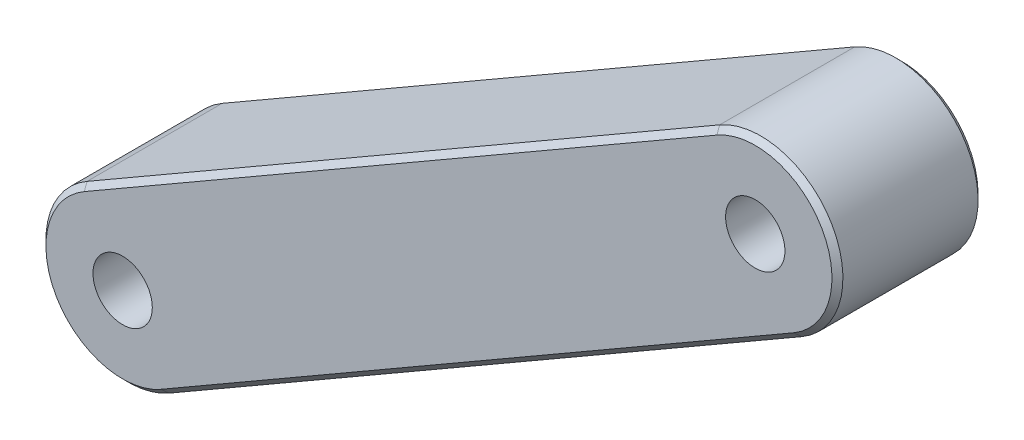
ISO-10303-21;
HEADER;
FILE_DESCRIPTION(('STEP AP214'),'2;1');
FILE_NAME('part.step','',(''),(''),'','','');
FILE_SCHEMA(('AUTOMOTIVE_DESIGN { 1 0 10303 214 1 1 1 1 }'));
ENDSEC;
DATA;
#1=APPLICATION_CONTEXT('core data for automotive mechanical design processes');
#2=APPLICATION_PROTOCOL_DEFINITION('international standard','automotive_design',2000,#1);
#3=PRODUCT_CONTEXT('',#1,'mechanical');
#4=PRODUCT('Part','Part','',(#3));
#5=PRODUCT_RELATED_PRODUCT_CATEGORY('part','',(#4));
#6=PRODUCT_DEFINITION_FORMATION('','',#4);
#7=PRODUCT_DEFINITION_CONTEXT('part definition',#1,'design');
#8=PRODUCT_DEFINITION('design','',#6,#7);
#9=PRODUCT_DEFINITION_SHAPE('','',#8);
#10=(LENGTH_UNIT() NAMED_UNIT(*) SI_UNIT(.MILLI.,.METRE.));
#11=(NAMED_UNIT(*) PLANE_ANGLE_UNIT() SI_UNIT($,.RADIAN.));
#12=(NAMED_UNIT(*) SI_UNIT($,.STERADIAN.) SOLID_ANGLE_UNIT());
#13=UNCERTAINTY_MEASURE_WITH_UNIT(LENGTH_MEASURE(1.E-05),#10,'distance_accuracy_value','');
#14=(GEOMETRIC_REPRESENTATION_CONTEXT(3) GLOBAL_UNCERTAINTY_ASSIGNED_CONTEXT((#13)) GLOBAL_UNIT_ASSIGNED_CONTEXT((#10,
#11,#12)) REPRESENTATION_CONTEXT('',''));
#15=CARTESIAN_POINT('',(0.,0.,0.));
#16=DIRECTION('',(0.,0.,1.));
#17=DIRECTION('',(1.,0.,0.));
#18=AXIS2_PLACEMENT_3D('',#15,#16,#17);
#19=CARTESIAN_POINT('',(19.5705080756888,-37.8971143170299,-3.7));
#20=DIRECTION('',(-0.353553390593272,0.612372435695791,0.707106781186551));
#21=DIRECTION('',(0.866025403784439,0.5,0.));
#22=AXIS2_PLACEMENT_3D('',#19,#20,#21);
#23=PLANE('',#22);
#24=DIRECTION('',(-0.353553390593276,0.612372435695794,-0.707106781186547));
#25=VECTOR('',#24,1.);
#26=CARTESIAN_POINT('',(2.25,-47.89711431703,-3.7));
#27=LINE('',#26,#25);
#28=CARTESIAN_POINT('',(2.25,-47.89711431703,-3.7));
#29=VERTEX_POINT('',#28);
#30=CARTESIAN_POINT('',(2.1,-47.6373066958946,-4.));
#31=VERTEX_POINT('',#30);
#32=EDGE_CURVE('E25',#29,#31,#27,.T.);
#33=ORIENTED_EDGE('',*,*,#32,.T.);
#34=DIRECTION('',(-0.866025403784439,-0.5,0.));
#35=VECTOR('',#34,1.);
#36=CARTESIAN_POINT('',(19.4205080756887,-37.6373066958947,-4.));
#37=LINE('',#36,#35);
#38=CARTESIAN_POINT('',(36.7410161513776,-27.6373066958946,-4.));
#39=VERTEX_POINT('',#38);
#40=EDGE_CURVE('E168',#39,#31,#37,.T.);
#41=ORIENTED_EDGE('',*,*,#40,.F.);
#42=DIRECTION('',(0.353553390593281,-0.612372435695797,0.707106781186542));
#43=VECTOR('',#42,1.);
#44=CARTESIAN_POINT('',(36.7410161513776,-27.6373066958946,-4.));
#45=LINE('',#44,#43);
#46=CARTESIAN_POINT('',(36.8910161513776,-27.89711431703,-3.7));
#47=VERTEX_POINT('',#46);
#48=EDGE_CURVE('E11',#39,#47,#45,.T.);
#49=ORIENTED_EDGE('',*,*,#48,.T.);
#50=DIRECTION('',(0.866025403784439,0.5,0.));
#51=VECTOR('',#50,1.);
#52=CARTESIAN_POINT('',(19.5705080756888,-37.8971143170299,-3.7));
#53=LINE('',#52,#51);
#54=EDGE_CURVE('E188',#29,#47,#53,.T.);
#55=ORIENTED_EDGE('',*,*,#54,.F.);
#56=EDGE_LOOP('',(#33,#41,#49,#55));
#57=FACE_BOUND('',#56,.T.);
#58=ADVANCED_FACE('F17',(#57),#23,.F.);
#59=CARTESIAN_POINT('',(34.6410161513775,-24.,-4.));
#60=DIRECTION('',(0.,0.,1.));
#61=DIRECTION('',(1.,0.,0.));
#62=AXIS2_PLACEMENT_3D('',#59,#60,#61);
#63=CONICAL_SURFACE('',#62,4.2,0.78539816339745);
#64=DIRECTION('',(-0.353553390593268,0.612372435695803,0.707106781186543));
#65=VECTOR('',#64,1.);
#66=CARTESIAN_POINT('',(32.5410161513775,-20.3626933041054,-4.));
#67=LINE('',#66,#65);
#68=CARTESIAN_POINT('',(32.5410161513775,-20.3626933041054,-4.));
#69=VERTEX_POINT('',#68);
#70=CARTESIAN_POINT('',(32.3910161513776,-20.10288568297,-3.7));
#71=VERTEX_POINT('',#70);
#72=EDGE_CURVE('E234',#69,#71,#67,.T.);
#73=ORIENTED_EDGE('',*,*,#72,.T.);
#74=CARTESIAN_POINT('',(34.6410161513775,-24.,-3.7));
#75=DIRECTION('',(0.,0.,1.));
#76=DIRECTION('',(1.,0.,0.));
#77=AXIS2_PLACEMENT_3D('',#74,#75,#76);
#78=CIRCLE('',#77,4.5);
#79=EDGE_CURVE('E189',#47,#71,#78,.T.);
#80=ORIENTED_EDGE('',*,*,#79,.F.);
#81=ORIENTED_EDGE('',*,*,#48,.F.);
#82=CARTESIAN_POINT('',(34.6410161513775,-24.,-4.));
#83=DIRECTION('',(0.,0.,-1.));
#84=DIRECTION('',(1.,0.,0.));
#85=AXIS2_PLACEMENT_3D('',#82,#83,#84);
#86=CIRCLE('',#85,4.2);
#87=EDGE_CURVE('E164',#69,#39,#86,.T.);
#88=ORIENTED_EDGE('',*,*,#87,.F.);
#89=EDGE_LOOP('',(#73,#80,#81,#88));
#90=FACE_BOUND('',#89,.T.);
#91=ADVANCED_FACE('F253',(#90),#63,.T.);
#92=CARTESIAN_POINT('',(0.,-44.,-4.));
#93=DIRECTION('',(0.,0.,1.));
#94=DIRECTION('',(1.,0.,0.));
#95=AXIS2_PLACEMENT_3D('',#92,#93,#94);
#96=CONICAL_SURFACE('',#95,4.2,0.78539816339745);
#97=DIRECTION('',(0.353553390593275,-0.612372435695797,-0.707106781186545));
#98=VECTOR('',#97,1.);
#99=CARTESIAN_POINT('',(-2.25,-40.10288568297,-3.7));
#100=LINE('',#99,#98);
#101=CARTESIAN_POINT('',(-2.25,-40.10288568297,-3.7));
#102=VERTEX_POINT('',#101);
#103=CARTESIAN_POINT('',(-2.1,-40.3626933041054,-4.));
#104=VERTEX_POINT('',#103);
#105=EDGE_CURVE('E237',#102,#104,#100,.T.);
#106=ORIENTED_EDGE('',*,*,#105,.T.);
#107=CARTESIAN_POINT('',(0.,-44.,-4.));
#108=DIRECTION('',(0.,0.,-1.));
#109=DIRECTION('',(1.,0.,0.));
#110=AXIS2_PLACEMENT_3D('',#107,#108,#109);
#111=CIRCLE('',#110,4.2);
#112=EDGE_CURVE('E176',#31,#104,#111,.T.);
#113=ORIENTED_EDGE('',*,*,#112,.F.);
#114=ORIENTED_EDGE('',*,*,#32,.F.);
#115=CARTESIAN_POINT('',(0.,-44.,-3.7));
#116=DIRECTION('',(0.,0.,1.));
#117=DIRECTION('',(1.,0.,0.));
#118=AXIS2_PLACEMENT_3D('',#115,#116,#117);
#119=CIRCLE('',#118,4.5);
#120=EDGE_CURVE('E141',#102,#29,#119,.T.);
#121=ORIENTED_EDGE('',*,*,#120,.F.);
#122=EDGE_LOOP('',(#106,#113,#114,#121));
#123=FACE_BOUND('',#122,.T.);
#124=ADVANCED_FACE('F247',(#123),#96,.T.);
#125=CARTESIAN_POINT('',(15.2205080756887,-30.3626933041054,-4.));
#126=DIRECTION('',(-0.353553390593274,0.612372435695794,-0.707106781186548));
#127=DIRECTION('',(-0.894427190999916,0.,0.447213595499958));
#128=AXIS2_PLACEMENT_3D('',#125,#126,#127);
#129=PLANE('',#128);
#130=ORIENTED_EDGE('',*,*,#72,.F.);
#131=DIRECTION('',(0.866025403784439,0.5,0.));
#132=VECTOR('',#131,1.);
#133=CARTESIAN_POINT('',(32.5410161513775,-20.3626933041054,-4.));
#134=LINE('',#133,#132);
#135=EDGE_CURVE('E197',#104,#69,#134,.T.);
#136=ORIENTED_EDGE('',*,*,#135,.F.);
#137=ORIENTED_EDGE('',*,*,#105,.F.);
#138=DIRECTION('',(-0.866025403784439,-0.5,0.));
#139=VECTOR('',#138,1.);
#140=CARTESIAN_POINT('',(-2.25,-40.10288568297,-3.7));
#141=LINE('',#140,#139);
#142=EDGE_CURVE('E155',#71,#102,#141,.T.);
#143=ORIENTED_EDGE('',*,*,#142,.F.);
#144=EDGE_LOOP('',(#130,#136,#137,#143));
#145=FACE_BOUND('',#144,.T.);
#146=ADVANCED_FACE('F428',(#145),#129,.T.);
#147=CARTESIAN_POINT('',(19.4205080756888,-37.6373066958947,4.));
#148=DIRECTION('',(0.353553390593272,-0.612372435695791,0.707106781186551));
#149=DIRECTION('',(-0.866025403784439,-0.5,0.));
#150=AXIS2_PLACEMENT_3D('',#147,#148,#149);
#151=PLANE('',#150);
#152=DIRECTION('',(0.353553390593278,-0.612372435695794,-0.707106781186547));
#153=VECTOR('',#152,1.);
#154=CARTESIAN_POINT('',(2.1,-47.6373066958946,4.));
#155=LINE('',#154,#153);
#156=CARTESIAN_POINT('',(2.1,-47.6373066958946,4.));
#157=VERTEX_POINT('',#156);
#158=CARTESIAN_POINT('',(2.25,-47.89711431703,3.7));
#159=VERTEX_POINT('',#158);
#160=EDGE_CURVE('E129',#157,#159,#155,.T.);
#161=ORIENTED_EDGE('',*,*,#160,.T.);
#162=DIRECTION('',(-0.866025403784439,-0.5,0.));
#163=VECTOR('',#162,1.);
#164=CARTESIAN_POINT('',(2.25,-47.89711431703,3.7));
#165=LINE('',#164,#163);
#166=CARTESIAN_POINT('',(36.8910161513776,-27.89711431703,3.7));
#167=VERTEX_POINT('',#166);
#168=EDGE_CURVE('E184',#167,#159,#165,.T.);
#169=ORIENTED_EDGE('',*,*,#168,.F.);
#170=DIRECTION('',(-0.353553390593267,0.612372435695801,0.707106781186546));
#171=VECTOR('',#170,1.);
#172=CARTESIAN_POINT('',(36.8910161513776,-27.89711431703,3.7));
#173=LINE('',#172,#171);
#174=CARTESIAN_POINT('',(36.7410161513776,-27.6373066958946,4.));
#175=VERTEX_POINT('',#174);
#176=EDGE_CURVE('E231',#167,#175,#173,.T.);
#177=ORIENTED_EDGE('',*,*,#176,.T.);
#178=DIRECTION('',(0.866025403784439,0.5,0.));
#179=VECTOR('',#178,1.);
#180=CARTESIAN_POINT('',(36.7410161513776,-27.6373066958946,4.));
#181=LINE('',#180,#179);
#182=EDGE_CURVE('E204',#157,#175,#181,.T.);
#183=ORIENTED_EDGE('',*,*,#182,.F.);
#184=EDGE_LOOP('',(#161,#169,#177,#183));
#185=FACE_BOUND('',#184,.T.);
#186=ADVANCED_FACE('F264',(#185),#151,.T.);
#187=CARTESIAN_POINT('',(34.6410161513775,-24.,3.7));
#188=DIRECTION('',(0.,0.,-1.));
#189=DIRECTION('',(-1.,0.,0.));
#190=AXIS2_PLACEMENT_3D('',#187,#188,#189);
#191=CONICAL_SURFACE('',#190,4.5,0.785398163397446);
#192=DIRECTION('',(0.353553390593267,-0.612372435695794,0.707106781186552));
#193=VECTOR('',#192,1.);
#194=CARTESIAN_POINT('',(32.3910161513776,-20.10288568297,3.7));
#195=LINE('',#194,#193);
#196=CARTESIAN_POINT('',(32.3910161513776,-20.10288568297,3.7));
#197=VERTEX_POINT('',#196);
#198=CARTESIAN_POINT('',(32.5410161513775,-20.3626933041054,4.));
#199=VERTEX_POINT('',#198);
#200=EDGE_CURVE('E130',#197,#199,#195,.T.);
#201=ORIENTED_EDGE('',*,*,#200,.T.);
#202=CARTESIAN_POINT('',(34.6410161513775,-24.,4.));
#203=DIRECTION('',(0.,0.,1.));
#204=DIRECTION('',(1.,0.,0.));
#205=AXIS2_PLACEMENT_3D('',#202,#203,#204);
#206=CIRCLE('',#205,4.2);
#207=EDGE_CURVE('E208',#175,#199,#206,.T.);
#208=ORIENTED_EDGE('',*,*,#207,.F.);
#209=ORIENTED_EDGE('',*,*,#176,.F.);
#210=CARTESIAN_POINT('',(34.6410161513775,-24.,3.7));
#211=DIRECTION('',(0.,0.,-1.));
#212=DIRECTION('',(1.,0.,0.));
#213=AXIS2_PLACEMENT_3D('',#210,#211,#212);
#214=CIRCLE('',#213,4.5);
#215=EDGE_CURVE('E193',#197,#167,#214,.T.);
#216=ORIENTED_EDGE('',*,*,#215,.F.);
#217=EDGE_LOOP('',(#201,#208,#209,#216));
#218=FACE_BOUND('',#217,.T.);
#219=ADVANCED_FACE('F427',(#218),#191,.T.);
#220=CARTESIAN_POINT('',(0.,-44.,3.7));
#221=DIRECTION('',(0.,0.,-1.));
#222=DIRECTION('',(-1.,0.,0.));
#223=AXIS2_PLACEMENT_3D('',#220,#221,#222);
#224=CONICAL_SURFACE('',#223,4.5,0.78539816339745);
#225=DIRECTION('',(-0.353553390593273,0.612372435695792,-0.70710678118655));
#226=VECTOR('',#225,1.);
#227=CARTESIAN_POINT('',(-2.1,-40.3626933041054,4.));
#228=LINE('',#227,#226);
#229=CARTESIAN_POINT('',(-2.1,-40.3626933041054,4.));
#230=VERTEX_POINT('',#229);
#231=CARTESIAN_POINT('',(-2.25,-40.10288568297,3.7));
#232=VERTEX_POINT('',#231);
#233=EDGE_CURVE('E117',#230,#232,#228,.T.);
#234=ORIENTED_EDGE('',*,*,#233,.T.);
#235=CARTESIAN_POINT('',(0.,-44.,3.7));
#236=DIRECTION('',(0.,0.,-1.));
#237=DIRECTION('',(1.,0.,0.));
#238=AXIS2_PLACEMENT_3D('',#235,#236,#237);
#239=CIRCLE('',#238,4.5);
#240=EDGE_CURVE('E120',#159,#232,#239,.T.);
#241=ORIENTED_EDGE('',*,*,#240,.F.);
#242=ORIENTED_EDGE('',*,*,#160,.F.);
#243=CARTESIAN_POINT('',(0.,-44.,4.));
#244=DIRECTION('',(0.,0.,1.));
#245=DIRECTION('',(1.,0.,0.));
#246=AXIS2_PLACEMENT_3D('',#243,#244,#245);
#247=CIRCLE('',#246,4.2);
#248=EDGE_CURVE('E123',#230,#157,#247,.T.);
#249=ORIENTED_EDGE('',*,*,#248,.F.);
#250=EDGE_LOOP('',(#234,#241,#242,#249));
#251=FACE_BOUND('',#250,.T.);
#252=ADVANCED_FACE('F119',(#251),#224,.T.);
#253=CARTESIAN_POINT('',(15.0705080756888,-30.10288568297,3.7));
#254=DIRECTION('',(0.353553390593274,-0.612372435695794,-0.707106781186548));
#255=DIRECTION('',(0.,-0.755928946018455,0.654653670707977));
#256=AXIS2_PLACEMENT_3D('',#253,#254,#255);
#257=PLANE('',#256);
#258=ORIENTED_EDGE('',*,*,#200,.F.);
#259=DIRECTION('',(0.866025403784439,0.5,0.));
#260=VECTOR('',#259,1.);
#261=CARTESIAN_POINT('',(15.0705080756888,-30.10288568297,3.7));
#262=LINE('',#261,#260);
#263=EDGE_CURVE('E144',#232,#197,#262,.T.);
#264=ORIENTED_EDGE('',*,*,#263,.F.);
#265=ORIENTED_EDGE('',*,*,#233,.F.);
#266=DIRECTION('',(-0.866025403784439,-0.5,0.));
#267=VECTOR('',#266,1.);
#268=CARTESIAN_POINT('',(15.2205080756887,-30.3626933041054,4.));
#269=LINE('',#268,#267);
#270=EDGE_CURVE('E214',#199,#230,#269,.T.);
#271=ORIENTED_EDGE('',*,*,#270,.F.);
#272=EDGE_LOOP('',(#258,#264,#265,#271));
#273=FACE_BOUND('',#272,.T.);
#274=ADVANCED_FACE('F145',(#273),#257,.F.);
#275=CARTESIAN_POINT('',(0.,-44.,-78.7236498692896));
#276=DIRECTION('',(0.,0.,1.));
#277=DIRECTION('',(1.,0.,0.));
#278=AXIS2_PLACEMENT_3D('',#275,#276,#277);
#279=CYLINDRICAL_SURFACE('',#278,1.625);
#280=CARTESIAN_POINT('',(0.,-44.,-4.));
#281=DIRECTION('',(0.,0.,1.));
#282=DIRECTION('',(1.,0.,0.));
#283=AXIS2_PLACEMENT_3D('',#280,#281,#282);
#284=CIRCLE('',#283,1.625);
#285=CARTESIAN_POINT('',(1.625,-44.,-4.));
#286=VERTEX_POINT('',#285);
#287=EDGE_CURVE('E42',#286,#286,#284,.T.);
#288=ORIENTED_EDGE('',*,*,#287,.F.);
#289=EDGE_LOOP('',(#288));
#290=FACE_BOUND('',#289,.T.);
#291=CARTESIAN_POINT('',(0.,-44.,4.));
#292=DIRECTION('',(0.,0.,1.));
#293=DIRECTION('',(1.,0.,0.));
#294=AXIS2_PLACEMENT_3D('',#291,#292,#293);
#295=CIRCLE('',#294,1.625);
#296=CARTESIAN_POINT('',(1.625,-44.,4.));
#297=VERTEX_POINT('',#296);
#298=EDGE_CURVE('E217',#297,#297,#295,.T.);
#299=ORIENTED_EDGE('',*,*,#298,.T.);
#300=EDGE_LOOP('',(#299));
#301=FACE_BOUND('',#300,.T.);
#302=ADVANCED_FACE('F436',(#290,#301),#279,.F.);
#303=CARTESIAN_POINT('',(34.6410161513775,-24.,-78.7236498692896));
#304=DIRECTION('',(0.,0.,1.));
#305=DIRECTION('',(1.,0.,0.));
#306=AXIS2_PLACEMENT_3D('',#303,#304,#305);
#307=CYLINDRICAL_SURFACE('',#306,1.625);
#308=CARTESIAN_POINT('',(34.6410161513775,-24.,-4.));
#309=DIRECTION('',(0.,0.,1.));
#310=DIRECTION('',(1.,0.,0.));
#311=AXIS2_PLACEMENT_3D('',#308,#309,#310);
#312=CIRCLE('',#311,1.625);
#313=CARTESIAN_POINT('',(36.2660161513775,-24.,-4.));
#314=VERTEX_POINT('',#313);
#315=EDGE_CURVE('E35',#314,#314,#312,.T.);
#316=ORIENTED_EDGE('',*,*,#315,.F.);
#317=EDGE_LOOP('',(#316));
#318=FACE_BOUND('',#317,.T.);
#319=CARTESIAN_POINT('',(34.6410161513775,-24.,4.));
#320=DIRECTION('',(0.,0.,1.));
#321=DIRECTION('',(1.,0.,0.));
#322=AXIS2_PLACEMENT_3D('',#319,#320,#321);
#323=CIRCLE('',#322,1.625);
#324=CARTESIAN_POINT('',(36.2660161513775,-24.,4.));
#325=VERTEX_POINT('',#324);
#326=EDGE_CURVE('E169',#325,#325,#323,.T.);
#327=ORIENTED_EDGE('',*,*,#326,.T.);
#328=EDGE_LOOP('',(#327));
#329=FACE_BOUND('',#328,.T.);
#330=ADVANCED_FACE('F441',(#318,#329),#307,.F.);
#331=CARTESIAN_POINT('',(17.3205080756888,-34.,-4.));
#332=DIRECTION('',(0.,0.,1.));
#333=DIRECTION('',(1.,0.,0.));
#334=AXIS2_PLACEMENT_3D('',#331,#332,#333);
#335=PLANE('',#334);
#336=ORIENTED_EDGE('',*,*,#315,.T.);
#337=EDGE_LOOP('',(#336));
#338=FACE_BOUND('',#337,.T.);
#339=ORIENTED_EDGE('',*,*,#287,.T.);
#340=EDGE_LOOP('',(#339));
#341=FACE_BOUND('',#340,.T.);
#342=ORIENTED_EDGE('',*,*,#87,.T.);
#343=ORIENTED_EDGE('',*,*,#40,.T.);
#344=ORIENTED_EDGE('',*,*,#112,.T.);
#345=ORIENTED_EDGE('',*,*,#135,.T.);
#346=EDGE_LOOP('',(#342,#343,#344,#345));
#347=FACE_BOUND('',#346,.T.);
#348=ADVANCED_FACE('F250',(#338,#341,#347),#335,.F.);
#349=CARTESIAN_POINT('',(17.3205080756888,-34.,4.));
#350=DIRECTION('',(0.,0.,1.));
#351=DIRECTION('',(1.,0.,0.));
#352=AXIS2_PLACEMENT_3D('',#349,#350,#351);
#353=PLANE('',#352);
#354=ORIENTED_EDGE('',*,*,#326,.F.);
#355=EDGE_LOOP('',(#354));
#356=FACE_BOUND('',#355,.T.);
#357=ORIENTED_EDGE('',*,*,#298,.F.);
#358=EDGE_LOOP('',(#357));
#359=FACE_BOUND('',#358,.T.);
#360=ORIENTED_EDGE('',*,*,#248,.T.);
#361=ORIENTED_EDGE('',*,*,#182,.T.);
#362=ORIENTED_EDGE('',*,*,#207,.T.);
#363=ORIENTED_EDGE('',*,*,#270,.T.);
#364=EDGE_LOOP('',(#360,#361,#362,#363));
#365=FACE_BOUND('',#364,.T.);
#366=ADVANCED_FACE('F462',(#356,#359,#365),#353,.T.);
#367=CARTESIAN_POINT('',(34.6410161513775,-24.,4.));
#368=DIRECTION('',(0.,0.,-1.));
#369=DIRECTION('',(-1.,0.,0.));
#370=AXIS2_PLACEMENT_3D('',#367,#368,#369);
#371=CYLINDRICAL_SURFACE('',#370,4.5);
#372=DIRECTION('',(0.,0.,-1.));
#373=VECTOR('',#372,1.);
#374=CARTESIAN_POINT('',(32.3910161513776,-20.10288568297,4.));
#375=LINE('',#374,#373);
#376=EDGE_CURVE('E150',#197,#71,#375,.T.);
#377=ORIENTED_EDGE('',*,*,#376,.F.);
#378=ORIENTED_EDGE('',*,*,#215,.T.);
#379=DIRECTION('',(0.,0.,-1.));
#380=VECTOR('',#379,1.);
#381=CARTESIAN_POINT('',(36.8910161513776,-27.89711431703,4.));
#382=LINE('',#381,#380);
#383=EDGE_CURVE('E180',#167,#47,#382,.T.);
#384=ORIENTED_EDGE('',*,*,#383,.T.);
#385=ORIENTED_EDGE('',*,*,#79,.T.);
#386=EDGE_LOOP('',(#377,#378,#384,#385));
#387=FACE_BOUND('',#386,.T.);
#388=ADVANCED_FACE('F260',(#387),#371,.T.);
#389=CARTESIAN_POINT('',(19.5705080756888,-37.8971143170299,4.));
#390=DIRECTION('',(-0.5,0.866025403784439,0.));
#391=DIRECTION('',(0.,0.,1.));
#392=AXIS2_PLACEMENT_3D('',#389,#390,#391);
#393=PLANE('',#392);
#394=ORIENTED_EDGE('',*,*,#383,.F.);
#395=ORIENTED_EDGE('',*,*,#168,.T.);
#396=DIRECTION('',(0.,0.,-1.));
#397=VECTOR('',#396,1.);
#398=CARTESIAN_POINT('',(2.25,-47.89711431703,4.));
#399=LINE('',#398,#397);
#400=EDGE_CURVE('E139',#159,#29,#399,.T.);
#401=ORIENTED_EDGE('',*,*,#400,.T.);
#402=ORIENTED_EDGE('',*,*,#54,.T.);
#403=EDGE_LOOP('',(#394,#395,#401,#402));
#404=FACE_BOUND('',#403,.T.);
#405=ADVANCED_FACE('F259',(#404),#393,.F.);
#406=CARTESIAN_POINT('',(0.,-44.,4.));
#407=DIRECTION('',(0.,0.,-1.));
#408=DIRECTION('',(-1.,0.,0.));
#409=AXIS2_PLACEMENT_3D('',#406,#407,#408);
#410=CYLINDRICAL_SURFACE('',#409,4.5);
#411=ORIENTED_EDGE('',*,*,#400,.F.);
#412=ORIENTED_EDGE('',*,*,#240,.T.);
#413=DIRECTION('',(0.,0.,-1.));
#414=VECTOR('',#413,1.);
#415=CARTESIAN_POINT('',(-2.25,-40.10288568297,4.));
#416=LINE('',#415,#414);
#417=EDGE_CURVE('E137',#232,#102,#416,.T.);
#418=ORIENTED_EDGE('',*,*,#417,.T.);
#419=ORIENTED_EDGE('',*,*,#120,.T.);
#420=EDGE_LOOP('',(#411,#412,#418,#419));
#421=FACE_BOUND('',#420,.T.);
#422=ADVANCED_FACE('F134',(#421),#410,.T.);
#423=CARTESIAN_POINT('',(15.0705080756888,-30.10288568297,4.));
#424=DIRECTION('',(-0.5,0.866025403784439,0.));
#425=DIRECTION('',(0.,0.,1.));
#426=AXIS2_PLACEMENT_3D('',#423,#424,#425);
#427=PLANE('',#426);
#428=ORIENTED_EDGE('',*,*,#417,.F.);
#429=ORIENTED_EDGE('',*,*,#263,.T.);
#430=ORIENTED_EDGE('',*,*,#376,.T.);
#431=ORIENTED_EDGE('',*,*,#142,.T.);
#432=EDGE_LOOP('',(#428,#429,#430,#431));
#433=FACE_BOUND('',#432,.T.);
#434=ADVANCED_FACE('F153',(#433),#427,.T.);
#435=CLOSED_SHELL('',(#58,#91,#124,#146,#186,#219,#252,#274,#302,#330,#348,#366,#388,#405,#422,#434));
#436=MANIFOLD_SOLID_BREP('B1',#435);
#437=ADVANCED_BREP_SHAPE_REPRESENTATION('',(#18,#436),#14);
#438=SHAPE_DEFINITION_REPRESENTATION(#9,#437);
ENDSEC;
END-ISO-10303-21;
